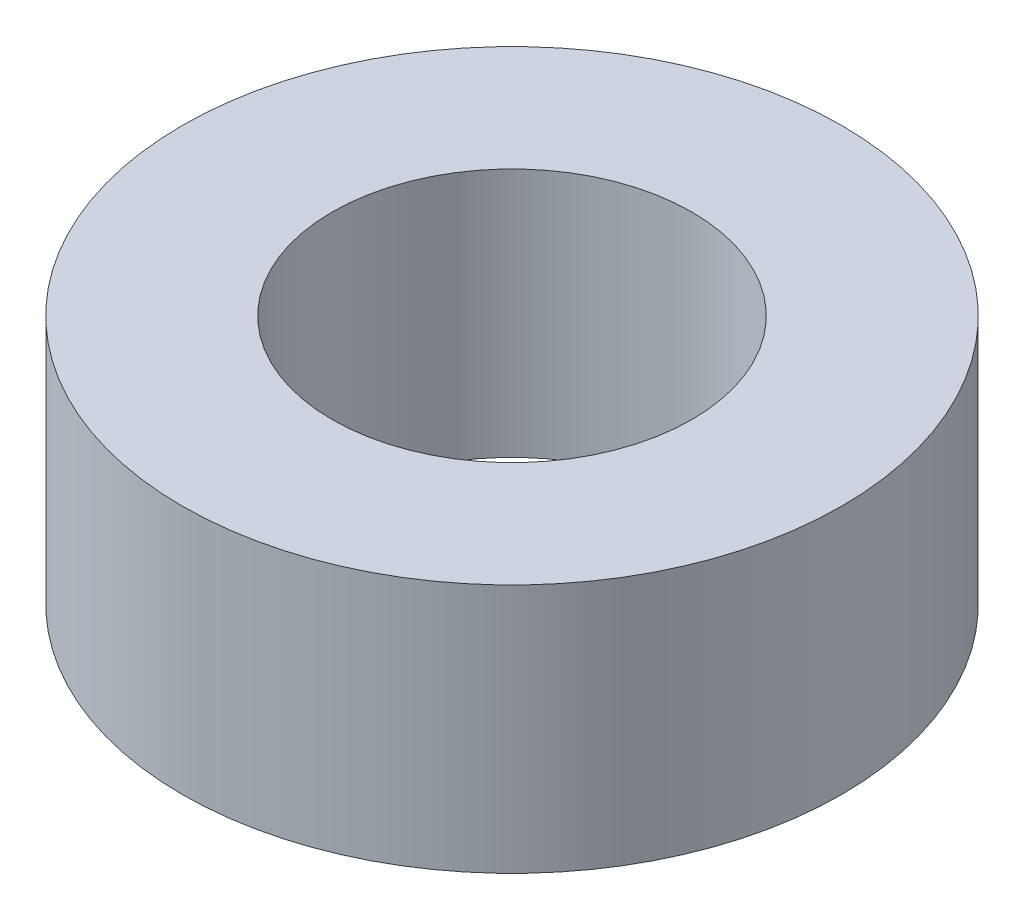
ISO-10303-21;
HEADER;
FILE_DESCRIPTION(('STEP AP214'),'2;1');
FILE_NAME('part.step','',(''),(''),'','','');
FILE_SCHEMA(('AUTOMOTIVE_DESIGN { 1 0 10303 214 1 1 1 1 }'));
ENDSEC;
DATA;
#1=APPLICATION_CONTEXT('core data for automotive mechanical design processes');
#2=APPLICATION_PROTOCOL_DEFINITION('international standard','automotive_design',2000,#1);
#3=PRODUCT_CONTEXT('',#1,'mechanical');
#4=PRODUCT('Part','Part','',(#3));
#5=PRODUCT_RELATED_PRODUCT_CATEGORY('part','',(#4));
#6=PRODUCT_DEFINITION_FORMATION('','',#4);
#7=PRODUCT_DEFINITION_CONTEXT('part definition',#1,'design');
#8=PRODUCT_DEFINITION('design','',#6,#7);
#9=PRODUCT_DEFINITION_SHAPE('','',#8);
#10=(LENGTH_UNIT() NAMED_UNIT(*) SI_UNIT(.MILLI.,.METRE.));
#11=(NAMED_UNIT(*) PLANE_ANGLE_UNIT() SI_UNIT($,.RADIAN.));
#12=(NAMED_UNIT(*) SI_UNIT($,.STERADIAN.) SOLID_ANGLE_UNIT());
#13=UNCERTAINTY_MEASURE_WITH_UNIT(LENGTH_MEASURE(1.E-05),#10,'distance_accuracy_value','');
#14=(GEOMETRIC_REPRESENTATION_CONTEXT(3) GLOBAL_UNCERTAINTY_ASSIGNED_CONTEXT((#13)) GLOBAL_UNIT_ASSIGNED_CONTEXT((#10,
#11,#12)) REPRESENTATION_CONTEXT('',''));
#15=CARTESIAN_POINT('',(0.,0.,0.));
#16=DIRECTION('',(0.,0.,1.));
#17=DIRECTION('',(1.,0.,0.));
#18=AXIS2_PLACEMENT_3D('',#15,#16,#17);
#19=CARTESIAN_POINT('',(0.,2.5,0.));
#20=DIRECTION('',(0.,1.,0.));
#21=DIRECTION('',(0.,0.,1.));
#22=AXIS2_PLACEMENT_3D('',#19,#20,#21);
#23=PLANE('',#22);
#24=CARTESIAN_POINT('',(0.,2.5,0.));
#25=DIRECTION('',(0.,1.,0.));
#26=DIRECTION('',(0.,0.,1.));
#27=AXIS2_PLACEMENT_3D('',#24,#25,#26);
#28=CIRCLE('',#27,3.3);
#29=CARTESIAN_POINT('',(0.,2.5,3.3));
#30=VERTEX_POINT('',#29);
#31=EDGE_CURVE('E10',#30,#30,#28,.T.);
#32=ORIENTED_EDGE('',*,*,#31,.T.);
#33=EDGE_LOOP('',(#32));
#34=FACE_BOUND('',#33,.T.);
#35=CARTESIAN_POINT('',(0.,2.5,0.));
#36=DIRECTION('',(0.,1.,0.));
#37=DIRECTION('',(0.,0.,1.));
#38=AXIS2_PLACEMENT_3D('',#35,#36,#37);
#39=CIRCLE('',#38,1.8);
#40=CARTESIAN_POINT('',(0.,2.5,1.8));
#41=VERTEX_POINT('',#40);
#42=EDGE_CURVE('E56',#41,#41,#39,.T.);
#43=ORIENTED_EDGE('',*,*,#42,.F.);
#44=EDGE_LOOP('',(#43));
#45=FACE_BOUND('',#44,.T.);
#46=ADVANCED_FACE('F43',(#34,#45),#23,.T.);
#47=CARTESIAN_POINT('',(0.,0.,0.));
#48=DIRECTION('',(0.,1.,0.));
#49=DIRECTION('',(0.,0.,1.));
#50=AXIS2_PLACEMENT_3D('',#47,#48,#49);
#51=PLANE('',#50);
#52=CARTESIAN_POINT('',(0.,0.,0.));
#53=DIRECTION('',(0.,1.,0.));
#54=DIRECTION('',(0.,0.,1.));
#55=AXIS2_PLACEMENT_3D('',#52,#53,#54);
#56=CIRCLE('',#55,3.3);
#57=CARTESIAN_POINT('',(0.,0.,3.3));
#58=VERTEX_POINT('',#57);
#59=EDGE_CURVE('E47',#58,#58,#56,.T.);
#60=ORIENTED_EDGE('',*,*,#59,.F.);
#61=EDGE_LOOP('',(#60));
#62=FACE_BOUND('',#61,.T.);
#63=CARTESIAN_POINT('',(0.,0.,0.));
#64=DIRECTION('',(0.,1.,0.));
#65=DIRECTION('',(0.,0.,1.));
#66=AXIS2_PLACEMENT_3D('',#63,#64,#65);
#67=CIRCLE('',#66,1.8);
#68=CARTESIAN_POINT('',(0.,0.,1.8));
#69=VERTEX_POINT('',#68);
#70=EDGE_CURVE('E58',#69,#69,#67,.T.);
#71=ORIENTED_EDGE('',*,*,#70,.T.);
#72=EDGE_LOOP('',(#71));
#73=FACE_BOUND('',#72,.T.);
#74=ADVANCED_FACE('F70',(#62,#73),#51,.F.);
#75=CARTESIAN_POINT('',(0.,2.5,0.));
#76=DIRECTION('',(0.,-1.,0.));
#77=DIRECTION('',(0.,0.,-1.));
#78=AXIS2_PLACEMENT_3D('',#75,#76,#77);
#79=CYLINDRICAL_SURFACE('',#78,3.3);
#80=ORIENTED_EDGE('',*,*,#31,.F.);
#81=EDGE_LOOP('',(#80));
#82=FACE_BOUND('',#81,.T.);
#83=ORIENTED_EDGE('',*,*,#59,.T.);
#84=EDGE_LOOP('',(#83));
#85=FACE_BOUND('',#84,.T.);
#86=ADVANCED_FACE('F45',(#82,#85),#79,.T.);
#87=CARTESIAN_POINT('',(0.,2.5,0.));
#88=DIRECTION('',(0.,-1.,0.));
#89=DIRECTION('',(0.,0.,-1.));
#90=AXIS2_PLACEMENT_3D('',#87,#88,#89);
#91=CYLINDRICAL_SURFACE('',#90,1.8);
#92=ORIENTED_EDGE('',*,*,#42,.T.);
#93=EDGE_LOOP('',(#92));
#94=FACE_BOUND('',#93,.T.);
#95=ORIENTED_EDGE('',*,*,#70,.F.);
#96=EDGE_LOOP('',(#95));
#97=FACE_BOUND('',#96,.T.);
#98=ADVANCED_FACE('F66',(#94,#97),#91,.F.);
#99=CLOSED_SHELL('',(#46,#74,#86,#98));
#100=MANIFOLD_SOLID_BREP('B2',#99);
#101=ADVANCED_BREP_SHAPE_REPRESENTATION('',(#18,#100),#14);
#102=SHAPE_DEFINITION_REPRESENTATION(#9,#101);
ENDSEC;
END-ISO-10303-21;
